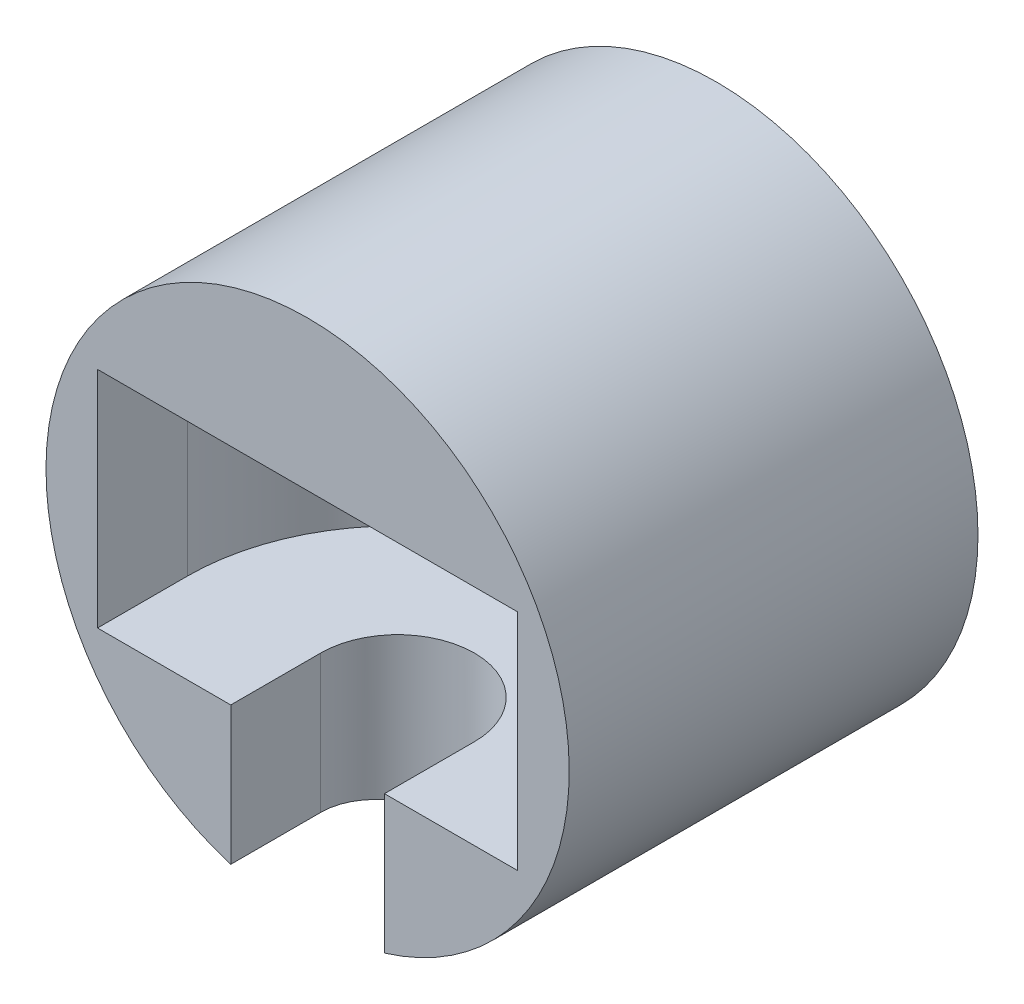
ISO-10303-21;
HEADER;
FILE_DESCRIPTION(('STEP AP214'),'2;1');
FILE_NAME('part.step','',(''),(''),'','','');
FILE_SCHEMA(('AUTOMOTIVE_DESIGN { 1 0 10303 214 1 1 1 1 }'));
ENDSEC;
DATA;
#1=APPLICATION_CONTEXT('core data for automotive mechanical design processes');
#2=APPLICATION_PROTOCOL_DEFINITION('international standard','automotive_design',2000,#1);
#3=PRODUCT_CONTEXT('',#1,'mechanical');
#4=PRODUCT('Part','Part','',(#3));
#5=PRODUCT_RELATED_PRODUCT_CATEGORY('part','',(#4));
#6=PRODUCT_DEFINITION_FORMATION('','',#4);
#7=PRODUCT_DEFINITION_CONTEXT('part definition',#1,'design');
#8=PRODUCT_DEFINITION('design','',#6,#7);
#9=PRODUCT_DEFINITION_SHAPE('','',#8);
#10=(LENGTH_UNIT() NAMED_UNIT(*) SI_UNIT(.MILLI.,.METRE.));
#11=(NAMED_UNIT(*) PLANE_ANGLE_UNIT() SI_UNIT($,.RADIAN.));
#12=(NAMED_UNIT(*) SI_UNIT($,.STERADIAN.) SOLID_ANGLE_UNIT());
#13=UNCERTAINTY_MEASURE_WITH_UNIT(LENGTH_MEASURE(1.E-05),#10,'distance_accuracy_value','');
#14=(GEOMETRIC_REPRESENTATION_CONTEXT(3) GLOBAL_UNCERTAINTY_ASSIGNED_CONTEXT((#13)) GLOBAL_UNIT_ASSIGNED_CONTEXT((#10,
#11,#12)) REPRESENTATION_CONTEXT('',''));
#15=CARTESIAN_POINT('',(0.,0.,0.));
#16=DIRECTION('',(0.,0.,1.));
#17=DIRECTION('',(1.,0.,0.));
#18=AXIS2_PLACEMENT_3D('',#15,#16,#17);
#19=CARTESIAN_POINT('',(0.,0.,25.));
#20=DIRECTION('',(0.,0.,1.));
#21=DIRECTION('',(1.,0.,0.));
#22=AXIS2_PLACEMENT_3D('',#19,#20,#21);
#23=PLANE('',#22);
#24=DIRECTION('',(0.,1.,0.));
#25=VECTOR('',#24,1.);
#26=CARTESIAN_POINT('',(4.7,-16.001,25.));
#27=LINE('',#26,#25);
#28=CARTESIAN_POINT('',(4.7,-15.2941165158371,25.));
#29=VERTEX_POINT('',#28);
#30=CARTESIAN_POINT('',(4.7,-6.85,25.));
#31=VERTEX_POINT('',#30);
#32=EDGE_CURVE('E116',#29,#31,#27,.T.);
#33=ORIENTED_EDGE('',*,*,#32,.F.);
#34=CARTESIAN_POINT('',(0.,0.,25.));
#35=DIRECTION('',(0.,0.,1.));
#36=DIRECTION('',(1.,0.,0.));
#37=AXIS2_PLACEMENT_3D('',#34,#35,#36);
#38=CIRCLE('',#37,16.);
#39=CARTESIAN_POINT('',(-4.7,-15.2941165158371,25.));
#40=VERTEX_POINT('',#39);
#41=EDGE_CURVE('E122',#29,#40,#38,.T.);
#42=ORIENTED_EDGE('',*,*,#41,.T.);
#43=DIRECTION('',(0.,1.,0.));
#44=VECTOR('',#43,1.);
#45=CARTESIAN_POINT('',(-4.7,-16.001,25.));
#46=LINE('',#45,#44);
#47=CARTESIAN_POINT('',(-4.7,-6.85,25.));
#48=VERTEX_POINT('',#47);
#49=EDGE_CURVE('E103',#40,#48,#46,.T.);
#50=ORIENTED_EDGE('',*,*,#49,.T.);
#51=DIRECTION('',(1.,0.,0.));
#52=VECTOR('',#51,1.);
#53=CARTESIAN_POINT('',(-12.85,-6.85,25.));
#54=LINE('',#53,#52);
#55=CARTESIAN_POINT('',(-12.85,-6.85,25.));
#56=VERTEX_POINT('',#55);
#57=EDGE_CURVE('E204',#56,#48,#54,.T.);
#58=ORIENTED_EDGE('',*,*,#57,.F.);
#59=DIRECTION('',(0.,1.,0.));
#60=VECTOR('',#59,1.);
#61=CARTESIAN_POINT('',(-12.85,-6.85,25.));
#62=LINE('',#61,#60);
#63=CARTESIAN_POINT('',(-12.85,6.85,25.));
#64=VERTEX_POINT('',#63);
#65=EDGE_CURVE('E230',#56,#64,#62,.T.);
#66=ORIENTED_EDGE('',*,*,#65,.T.);
#67=DIRECTION('',(1.,0.,0.));
#68=VECTOR('',#67,1.);
#69=CARTESIAN_POINT('',(-12.85,6.85,25.));
#70=LINE('',#69,#68);
#71=CARTESIAN_POINT('',(12.85,6.85,25.));
#72=VERTEX_POINT('',#71);
#73=EDGE_CURVE('E219',#64,#72,#70,.T.);
#74=ORIENTED_EDGE('',*,*,#73,.T.);
#75=DIRECTION('',(0.,1.,0.));
#76=VECTOR('',#75,1.);
#77=CARTESIAN_POINT('',(12.85,-6.85,25.));
#78=LINE('',#77,#76);
#79=CARTESIAN_POINT('',(12.85,-6.85,25.));
#80=VERTEX_POINT('',#79);
#81=EDGE_CURVE('E227',#80,#72,#78,.T.);
#82=ORIENTED_EDGE('',*,*,#81,.F.);
#83=EDGE_CURVE('E203',#31,#80,#54,.T.);
#84=ORIENTED_EDGE('',*,*,#83,.F.);
#85=EDGE_LOOP('',(#33,#42,#50,#58,#66,#74,#82,#84));
#86=FACE_BOUND('',#85,.T.);
#87=ADVANCED_FACE('F39',(#86),#23,.T.);
#88=CARTESIAN_POINT('',(0.,0.,0.));
#89=DIRECTION('',(0.,0.,1.));
#90=DIRECTION('',(1.,0.,0.));
#91=AXIS2_PLACEMENT_3D('',#88,#89,#90);
#92=PLANE('',#91);
#93=CARTESIAN_POINT('',(0.,0.,0.));
#94=DIRECTION('',(0.,0.,1.));
#95=DIRECTION('',(1.,0.,0.));
#96=AXIS2_PLACEMENT_3D('',#93,#94,#95);
#97=CIRCLE('',#96,16.);
#98=CARTESIAN_POINT('',(16.,0.,0.));
#99=VERTEX_POINT('',#98);
#100=EDGE_CURVE('E131',#99,#99,#97,.T.);
#101=ORIENTED_EDGE('',*,*,#100,.F.);
#102=EDGE_LOOP('',(#101));
#103=FACE_BOUND('',#102,.T.);
#104=CARTESIAN_POINT('',(0.,0.,0.));
#105=DIRECTION('',(0.,0.,1.));
#106=DIRECTION('',(1.,0.,0.));
#107=AXIS2_PLACEMENT_3D('',#104,#105,#106);
#108=CIRCLE('',#107,3.);
#109=CARTESIAN_POINT('',(3.,0.,0.));
#110=VERTEX_POINT('',#109);
#111=EDGE_CURVE('E137',#110,#110,#108,.T.);
#112=ORIENTED_EDGE('',*,*,#111,.T.);
#113=EDGE_LOOP('',(#112));
#114=FACE_BOUND('',#113,.T.);
#115=ADVANCED_FACE('F253',(#103,#114),#92,.F.);
#116=CARTESIAN_POINT('',(0.,0.,25.));
#117=DIRECTION('',(0.,0.,-1.));
#118=DIRECTION('',(-1.,0.,0.));
#119=AXIS2_PLACEMENT_3D('',#116,#117,#118);
#120=CYLINDRICAL_SURFACE('',#119,16.);
#121=ORIENTED_EDGE('',*,*,#41,.F.);
#122=DIRECTION('',(0.,0.,-1.));
#123=VECTOR('',#122,1.);
#124=CARTESIAN_POINT('',(4.7,-15.2941165158371,25.));
#125=LINE('',#124,#123);
#126=CARTESIAN_POINT('',(4.7,-15.2941165158371,19.5));
#127=VERTEX_POINT('',#126);
#128=EDGE_CURVE('E126',#127,#29,#125,.F.);
#129=ORIENTED_EDGE('',*,*,#128,.F.);
#130=CARTESIAN_POINT('',(-4.7,-15.2941165158371,19.5));
#131=CARTESIAN_POINT('',(-4.70001722579124,-15.2940984911914,19.3708763082752));
#132=CARTESIAN_POINT('',(-4.69467959532677,-15.2957511508983,19.2417593694433));
#133=CARTESIAN_POINT('',(-4.67342256857162,-15.3022661358053,18.984508204904));
#134=CARTESIAN_POINT('',(-4.65750546907339,-15.3071277643399,18.8563737720018));
#135=CARTESIAN_POINT('',(-4.61526925327359,-15.3199133773802,18.602312180988));
#136=CARTESIAN_POINT('',(-4.58897576774615,-15.3278298151223,18.4763803766041));
#137=CARTESIAN_POINT('',(-4.5262242254477,-15.3464774972835,18.2272901426551));
#138=CARTESIAN_POINT('',(-4.48976592026478,-15.3572088104933,18.1041317809481));
#139=CARTESIAN_POINT('',(-4.4070055073212,-15.3811622942011,17.8614888464773));
#140=CARTESIAN_POINT('',(-4.36070883811933,-15.3943830880787,17.7420022855742));
#141=CARTESIAN_POINT('',(-4.25862992247319,-15.4229334616981,17.5073978493071));
#142=CARTESIAN_POINT('',(-4.20284414826205,-15.4382638253089,17.3922816182415));
#143=CARTESIAN_POINT('',(-4.0218311511316,-15.4867850041534,17.0545989340589));
#144=CARTESIAN_POINT('',(-3.88289744008188,-15.5225213483323,16.8395503315135));
#145=CARTESIAN_POINT('',(-3.56816800393936,-15.5979162855502,16.4296838288117));
#146=CARTESIAN_POINT('',(-3.39146957040254,-15.6376553167489,16.2355784145308));
#147=CARTESIAN_POINT('',(-3.00808711855809,-15.7159038781299,15.8792437246022));
#148=CARTESIAN_POINT('',(-2.80139808669533,-15.754413201425,15.7170197893066));
#149=CARTESIAN_POINT('',(-2.35887540797605,-15.8267773011811,15.4260339930174));
#150=CARTESIAN_POINT('',(-2.12254676966987,-15.8605251272551,15.2979962986612));
#151=CARTESIAN_POINT('',(-1.63056291961247,-15.9186216161317,15.0837574944262));
#152=CARTESIAN_POINT('',(-1.37491254914412,-15.9429726241401,14.9975459444265));
#153=CARTESIAN_POINT('',(-0.858992820259392,-15.9789590165522,14.8717519184727));
#154=CARTESIAN_POINT('',(-0.599043601139717,-15.9909255320816,14.8309528304415));
#155=CARTESIAN_POINT('',(-0.0757272893159784,-16.0019593685531,14.7932973725569));
#156=CARTESIAN_POINT('',(0.187639177046515,-16.0010290208842,14.7964330605367));
#157=CARTESIAN_POINT('',(0.701781987076624,-15.986609052891,14.8457363968185));
#158=CARTESIAN_POINT('',(0.95269714902101,-15.9735040204677,14.8905863762989));
#159=CARTESIAN_POINT('',(1.44326434772073,-15.936672546209,15.0198939164618));
#160=CARTESIAN_POINT('',(1.68291580259773,-15.9129455563127,15.1043535208919));
#161=CARTESIAN_POINT('',(2.14734195764715,-15.8569951667603,15.3114089637335));
#162=CARTESIAN_POINT('',(2.3719168890139,-15.8246783717435,15.4344268485726));
#163=CARTESIAN_POINT('',(2.79764060073814,-15.7549934982056,15.7147339994));
#164=CARTESIAN_POINT('',(2.99878433364763,-15.7176243350571,15.8720306286955));
#165=CARTESIAN_POINT('',(3.37988171524785,-15.6401924120016,16.2234273838237));
#166=CARTESIAN_POINT('',(3.5587785947666,-15.6000811423672,16.4186720640302));
#167=CARTESIAN_POINT('',(3.8007739519457,-15.5422339151979,16.73203561699));
#168=CARTESIAN_POINT('',(3.87709053299929,-15.523325993261,16.8399870129123));
#169=CARTESIAN_POINT('',(4.02044411990821,-15.4868166445026,17.0620774806235));
#170=CARTESIAN_POINT('',(4.08748474023834,-15.4692147100364,17.1762141180049));
#171=CARTESIAN_POINT('',(4.21240211941698,-15.435669671594,17.4110905645856));
#172=CARTESIAN_POINT('',(4.2701822732532,-15.4197445836125,17.5318842732742));
#173=CARTESIAN_POINT('',(4.37529241280977,-15.3902500196851,17.7781607867937));
#174=CARTESIAN_POINT('',(4.42262665920373,-15.376679583809,17.9036416553175));
#175=CARTESIAN_POINT('',(4.50641708325567,-15.3523324055034,18.158301526974));
#176=CARTESIAN_POINT('',(4.54288467377239,-15.3415527336072,18.2874764928894));
#177=CARTESIAN_POINT('',(4.60466012124381,-15.3231244085038,18.5486325143976));
#178=CARTESIAN_POINT('',(4.62997313556819,-15.3154743084421,18.6806122435452));
#179=CARTESIAN_POINT('',(4.66636734396714,-15.3044221302613,18.9271110694695));
#180=CARTESIAN_POINT('',(4.67898025459734,-15.3005648413854,19.0413861511911));
#181=CARTESIAN_POINT('',(4.69579514378743,-15.2954085279916,19.2704378623983));
#182=CARTESIAN_POINT('',(4.70000970338144,-15.2941056768805,19.3852134831475));
#183=CARTESIAN_POINT('',(4.7,-15.2941165158371,19.5));
#184=B_SPLINE_CURVE_WITH_KNOTS('',3,(#130,#131,#132,#133,#134,#135,#136,#137,#138,#139,#140,
#141,#142,#143,#144,#145,#146,#147,#148,#149,#150,#151,#152,#153,#154,#155,#156,#157,#158,#159,
#160,#161,#162,#163,#164,#165,#166,#167,#168,#169,#170,#171,#172,#173,#174,#175,#176,#177,#178,
#179,#180,#181,#182,#183),.UNSPECIFIED.,.F.,.F.,(4,2,2,2,2,2,2,2,2,2,2,2,2,2,2,2,2,2,2,2,2,2,2,
2,2,2,4),(0.,0.387239730218642,0.77439541851616,1.1606007175409,1.54681545563184,
1.93281725049951,2.31896286425264,3.09078761057912,3.88368109944087,4.67670729005339,
5.48539601040462,6.29388277197121,7.08014560456739,7.86626630488029,8.62836891009986,
9.39051084204202,10.1613047782044,10.9322644496304,11.7316934059132,12.1319552872169,
12.532060760407,12.9361010335717,13.3399762010621,13.743425685675,14.1466884373397,
14.4914600193035,14.8357147315061),.UNSPECIFIED.);
#185=CARTESIAN_POINT('',(-4.7,-15.2941165158371,19.5));
#186=VERTEX_POINT('',#185);
#187=EDGE_CURVE('E115',#186,#127,#184,.T.);
#188=ORIENTED_EDGE('',*,*,#187,.F.);
#189=DIRECTION('',(0.,0.,-1.));
#190=VECTOR('',#189,1.);
#191=CARTESIAN_POINT('',(-4.7,-15.2941165158371,25.));
#192=LINE('',#191,#190);
#193=EDGE_CURVE('E106',#40,#186,#192,.T.);
#194=ORIENTED_EDGE('',*,*,#193,.F.);
#195=EDGE_LOOP('',(#121,#129,#188,#194));
#196=FACE_BOUND('',#195,.T.);
#197=ORIENTED_EDGE('',*,*,#100,.T.);
#198=EDGE_LOOP('',(#197));
#199=FACE_BOUND('',#198,.T.);
#200=ADVANCED_FACE('F41',(#196,#199),#120,.T.);
#201=CARTESIAN_POINT('',(0.,0.,25.));
#202=DIRECTION('',(0.,0.,-1.));
#203=DIRECTION('',(-1.,0.,0.));
#204=AXIS2_PLACEMENT_3D('',#201,#202,#203);
#205=CYLINDRICAL_SURFACE('',#204,3.);
#206=CARTESIAN_POINT('',(-3.,0.,7.0051010408247));
#207=CARTESIAN_POINT('',(-2.99999470907691,0.166028512764044,7.0050977226662));
#208=CARTESIAN_POINT('',(-2.9861703506378,0.332118224622122,7.00175574512387));
#209=CARTESIAN_POINT('',(-2.93131117312189,0.659553322120775,6.98877779958548));
#210=CARTESIAN_POINT('',(-2.89025844150378,0.820895511520657,6.97913768834235));
#211=CARTESIAN_POINT('',(-2.78232300132453,1.13405201120201,6.95471342855461));
#212=CARTESIAN_POINT('',(-2.71547090047065,1.28587736483668,6.93993537758043));
#213=CARTESIAN_POINT('',(-2.55792474284669,1.5761670773805,6.906907794844));
#214=CARTESIAN_POINT('',(-2.46723048288505,1.71463132240767,6.88865823349665));
#215=CARTESIAN_POINT('',(-2.26271491067282,1.97692995008076,6.85035170744761));
#216=CARTESIAN_POINT('',(-2.14852080056412,2.10046994694851,6.83026894577286));
#217=CARTESIAN_POINT('',(-1.90105108475457,2.32682804913734,6.79078372480862));
#218=CARTESIAN_POINT('',(-1.76777386541687,2.4296444003285,6.77138132322218));
#219=CARTESIAN_POINT('',(-1.48392764218938,2.61281940607468,6.7351599183713));
#220=CARTESIAN_POINT('',(-1.33316940928446,2.69289213499781,6.7183749089768));
#221=CARTESIAN_POINT('',(-1.01987763299555,2.82645290036293,6.68957223017544));
#222=CARTESIAN_POINT('',(-0.857345602105575,2.87994434459418,6.67755394970155));
#223=CARTESIAN_POINT('',(-0.528184800652949,2.9578904169478,6.65982119277503));
#224=CARTESIAN_POINT('',(-0.361680133170343,2.9828440853866,6.65399850419767));
#225=CARTESIAN_POINT('',(-0.0267528819257883,3.00456936239959,6.64893707597122));
#226=CARTESIAN_POINT('',(0.141669450361024,3.00134462462409,6.64969748274894));
#227=CARTESIAN_POINT('',(0.472201427490859,2.96717050157748,6.65763484342673));
#228=CARTESIAN_POINT('',(0.634370157551069,2.93675935285471,6.66468722345705));
#229=CARTESIAN_POINT('',(0.951236413489698,2.84993675134363,6.68427280139516));
#230=CARTESIAN_POINT('',(1.1059335719623,2.79352402139311,6.69680626852491));
#231=CARTESIAN_POINT('',(1.40492475337524,2.65584220821386,6.72614166673384));
#232=CARTESIAN_POINT('',(1.54912400270651,2.5743748250684,6.74297746291281));
#233=CARTESIAN_POINT('',(1.82199766775204,2.38904523429732,6.77908033805682));
#234=CARTESIAN_POINT('',(1.95066969257344,2.28517958461603,6.7983477905179));
#235=CARTESIAN_POINT('',(2.19204216206519,2.0550915478133,6.83774186778517));
#236=CARTESIAN_POINT('',(2.30429265012156,1.92839831298789,6.85787803468096));
#237=CARTESIAN_POINT('',(2.50604586720338,1.65777560202987,6.89631749484081));
#238=CARTESIAN_POINT('',(2.59554779270593,1.51384551732275,6.91462072334813));
#239=CARTESIAN_POINT('',(2.74950260932628,1.21203719368933,6.94735157926365));
#240=CARTESIAN_POINT('',(2.81385994701871,1.05410849265619,6.96176435946618));
#241=CARTESIAN_POINT('',(2.91497945529914,0.729258857873723,6.98488458381211));
#242=CARTESIAN_POINT('',(2.95174668689482,0.562339579340169,6.99359307428806));
#243=CARTESIAN_POINT('',(2.99592240606394,0.228386530757243,7.004102383629));
#244=CARTESIAN_POINT('',(3.00399066673767,0.0614448166728867,7.00605840628464));
#245=CARTESIAN_POINT('',(2.99233482465829,-0.27139862561757,7.00326171898362));
#246=CARTESIAN_POINT('',(2.97261292178243,-0.437300435098627,6.99850954005005));
#247=CARTESIAN_POINT('',(2.90651188483389,-0.760988587354422,6.98297946596038));
#248=CARTESIAN_POINT('',(2.86050550795912,-0.918855476057042,6.97228588681592));
#249=CARTESIAN_POINT('',(2.74354945066474,-1.2246388725026,6.94615578739338));
#250=CARTESIAN_POINT('',(2.67259711634352,-1.37255431955563,6.93071876250092));
#251=CARTESIAN_POINT('',(2.50634295182768,-1.65706411090716,6.89650663930423));
#252=CARTESIAN_POINT('',(2.4106401358128,-1.79341759816103,6.87767828764235));
#253=CARTESIAN_POINT('',(2.19811820868278,-2.04837189686989,6.83894087588271));
#254=CARTESIAN_POINT('',(2.08129609070387,-2.16697017602323,6.81903166217984));
#255=CARTESIAN_POINT('',(1.82684659319313,-2.385659089224,6.77985759685747));
#256=CARTESIAN_POINT('',(1.68882581529335,-2.48529685779346,6.76061581025968));
#257=CARTESIAN_POINT('',(1.39762468512821,-2.65997507952997,6.7253914932114));
#258=CARTESIAN_POINT('',(1.24444508733414,-2.73501675607102,6.70940880067325));
#259=CARTESIAN_POINT('',(0.928287253424025,-2.85776748988647,6.68259956178073));
#260=CARTESIAN_POINT('',(0.765384125427537,-2.90566202111116,6.67173811419311));
#261=CARTESIAN_POINT('',(0.433558480162693,-2.97332910255011,6.65624333173442));
#262=CARTESIAN_POINT('',(0.26463697204927,-2.9931063449014,6.65160895771326));
#263=CARTESIAN_POINT('',(-0.0701522562818204,-3.0037421163149,6.6491266330523));
#264=CARTESIAN_POINT('',(-0.235997791780655,-2.99527308683819,6.6511208751742));
#265=CARTESIAN_POINT('',(-0.56383234553105,-2.95117726202601,6.66132821485638));
#266=CARTESIAN_POINT('',(-0.725821452664713,-2.91555109322835,6.66954116894576));
#267=CARTESIAN_POINT('',(-1.04074045967071,-2.81849280479648,6.69124551943138));
#268=CARTESIAN_POINT('',(-1.19370508786243,-2.75716813116513,6.70471492256616));
#269=CARTESIAN_POINT('',(-1.48725700699566,-2.61055412764395,6.73550334404514));
#270=CARTESIAN_POINT('',(-1.62784292164269,-2.52526213741901,6.75282278969351));
#271=CARTESIAN_POINT('',(-1.89588616581903,-2.33100654125102,6.78989254769476));
#272=CARTESIAN_POINT('',(-2.02300009474002,-2.22157744769058,6.80968677801784));
#273=CARTESIAN_POINT('',(-2.25728968118433,-1.9830770489688,6.84925721693834));
#274=CARTESIAN_POINT('',(-2.36446042569151,-1.85400091794715,6.86903341990384));
#275=CARTESIAN_POINT('',(-2.55745867062371,-1.57743017517992,6.9066783723353));
#276=CARTESIAN_POINT('',(-2.64292447029726,-1.42967809572537,6.92451228015908));
#277=CARTESIAN_POINT('',(-2.78767529883211,-1.1215149993868,6.95580248937792));
#278=CARTESIAN_POINT('',(-2.84698109481455,-0.961114143416836,6.96926226093849));
#279=CARTESIAN_POINT('',(-2.92793187163041,-0.667283901861408,6.98796452567447));
#280=CARTESIAN_POINT('',(-2.95490246496243,-0.535368551470736,6.99434554134607));
#281=CARTESIAN_POINT('',(-2.99093810295283,-0.268982081797949,7.00291500971609));
#282=CARTESIAN_POINT('',(-3.00000428654096,-0.134511125631671,7.00510372909329));
#283=CARTESIAN_POINT('',(-3.,0.,7.0051010408247));
#284=B_SPLINE_CURVE_WITH_KNOTS('',3,(#206,#207,#208,#209,#210,#211,#212,#213,#214,#215,#216,
#217,#218,#219,#220,#221,#222,#223,#224,#225,#226,#227,#228,#229,#230,#231,#232,#233,#234,#235,
#236,#237,#238,#239,#240,#241,#242,#243,#244,#245,#246,#247,#248,#249,#250,#251,#252,#253,#254,
#255,#256,#257,#258,#259,#260,#261,#262,#263,#264,#265,#266,#267,#268,#269,#270,#271,#272,#273,
#274,#275,#276,#277,#278,#279,#280,#281,#282,#283),.UNSPECIFIED.,.T.,.F.,(4,2,2,2,2,2,2,2,2,2,2,
2,2,2,2,2,2,2,2,2,2,2,2,2,2,2,2,2,2,2,2,2,2,2,2,2,2,2,4),(0.,0.497592131049229,
0.995511934706267,1.49284282614585,1.99017795615789,2.49611309620999,3.0020910426117,
3.51417375778937,4.02619080569376,4.52911030611778,5.03196459828575,5.52507859893712,
6.01821682325755,6.51536315866875,7.01258594760218,7.52157390661285,8.0305798415576,
8.5415016911446,9.05232979654984,9.5513355086411,10.0503017215173,10.5423614445903,
11.0344735317964,11.5351210728157,12.0358399498204,12.547327019869,13.0587886454294,
13.5667124017705,14.0745513872175,14.5703876798781,15.0662125335287,15.5599846960667,
16.053811688216,16.5581566611505,17.0626257157822,17.5750189219081,18.0870046293624,
18.4901639095587,18.8932975432859),.UNSPECIFIED.);
#285=CARTESIAN_POINT('',(-3.,0.,7.0051010408247));
#286=VERTEX_POINT('',#285);
#287=EDGE_CURVE('E142',#286,#286,#284,.T.);
#288=ORIENTED_EDGE('',*,*,#287,.F.);
#289=EDGE_LOOP('',(#288));
#290=FACE_BOUND('',#289,.T.);
#291=ORIENTED_EDGE('',*,*,#111,.F.);
#292=EDGE_LOOP('',(#291));
#293=FACE_BOUND('',#292,.T.);
#294=ADVANCED_FACE('F151',(#290,#293),#205,.F.);
#295=CARTESIAN_POINT('',(0.,-6.85,19.5));
#296=DIRECTION('',(0.,1.,0.));
#297=DIRECTION('',(0.,0.,1.));
#298=AXIS2_PLACEMENT_3D('',#295,#296,#297);
#299=CYLINDRICAL_SURFACE('',#298,12.85);
#300=ORIENTED_EDGE('',*,*,#287,.T.);
#301=EDGE_LOOP('',(#300));
#302=FACE_BOUND('',#301,.T.);
#303=CARTESIAN_POINT('',(0.,6.85,19.5));
#304=DIRECTION('',(0.,1.,0.));
#305=DIRECTION('',(0.,0.,1.));
#306=AXIS2_PLACEMENT_3D('',#303,#304,#305);
#307=CIRCLE('',#306,12.85);
#308=CARTESIAN_POINT('',(12.85,6.85,19.5));
#309=VERTEX_POINT('',#308);
#310=CARTESIAN_POINT('',(-12.85,6.85,19.5));
#311=VERTEX_POINT('',#310);
#312=EDGE_CURVE('E125',#309,#311,#307,.T.);
#313=ORIENTED_EDGE('',*,*,#312,.T.);
#314=DIRECTION('',(0.,1.,0.));
#315=VECTOR('',#314,1.);
#316=CARTESIAN_POINT('',(-12.85,-6.85,19.5));
#317=LINE('',#316,#315);
#318=CARTESIAN_POINT('',(-12.85,-6.85,19.5));
#319=VERTEX_POINT('',#318);
#320=EDGE_CURVE('E211',#319,#311,#317,.T.);
#321=ORIENTED_EDGE('',*,*,#320,.F.);
#322=CARTESIAN_POINT('',(0.,-6.85,19.5));
#323=DIRECTION('',(0.,1.,0.));
#324=DIRECTION('',(0.,0.,1.));
#325=AXIS2_PLACEMENT_3D('',#322,#323,#324);
#326=CIRCLE('',#325,12.85);
#327=CARTESIAN_POINT('',(12.85,-6.85,19.5));
#328=VERTEX_POINT('',#327);
#329=EDGE_CURVE('E195',#328,#319,#326,.T.);
#330=ORIENTED_EDGE('',*,*,#329,.F.);
#331=DIRECTION('',(0.,1.,0.));
#332=VECTOR('',#331,1.);
#333=CARTESIAN_POINT('',(12.85,-6.85,19.5));
#334=LINE('',#333,#332);
#335=EDGE_CURVE('E150',#328,#309,#334,.T.);
#336=ORIENTED_EDGE('',*,*,#335,.T.);
#337=EDGE_LOOP('',(#313,#321,#330,#336));
#338=FACE_BOUND('',#337,.T.);
#339=ADVANCED_FACE('F154',(#302,#338),#299,.F.);
#340=CARTESIAN_POINT('',(12.85,-6.85,25.));
#341=DIRECTION('',(1.,0.,0.));
#342=DIRECTION('',(0.,0.,-1.));
#343=AXIS2_PLACEMENT_3D('',#340,#341,#342);
#344=PLANE('',#343);
#345=DIRECTION('',(0.,0.,-1.));
#346=VECTOR('',#345,1.);
#347=CARTESIAN_POINT('',(12.85,6.85,25.));
#348=LINE('',#347,#346);
#349=EDGE_CURVE('E63',#72,#309,#348,.T.);
#350=ORIENTED_EDGE('',*,*,#349,.T.);
#351=ORIENTED_EDGE('',*,*,#335,.F.);
#352=DIRECTION('',(0.,0.,-1.));
#353=VECTOR('',#352,1.);
#354=CARTESIAN_POINT('',(12.85,-6.85,25.));
#355=LINE('',#354,#353);
#356=EDGE_CURVE('E207',#80,#328,#355,.T.);
#357=ORIENTED_EDGE('',*,*,#356,.F.);
#358=ORIENTED_EDGE('',*,*,#81,.T.);
#359=EDGE_LOOP('',(#350,#351,#357,#358));
#360=FACE_BOUND('',#359,.T.);
#361=ADVANCED_FACE('F158',(#360),#344,.F.);
#362=CARTESIAN_POINT('',(-12.85,-6.85,25.));
#363=DIRECTION('',(-1.,0.,0.));
#364=DIRECTION('',(0.,0.,1.));
#365=AXIS2_PLACEMENT_3D('',#362,#363,#364);
#366=PLANE('',#365);
#367=DIRECTION('',(0.,0.,1.));
#368=VECTOR('',#367,1.);
#369=CARTESIAN_POINT('',(-12.85,6.85,25.));
#370=LINE('',#369,#368);
#371=EDGE_CURVE('E215',#311,#64,#370,.T.);
#372=ORIENTED_EDGE('',*,*,#371,.T.);
#373=ORIENTED_EDGE('',*,*,#65,.F.);
#374=DIRECTION('',(0.,0.,1.));
#375=VECTOR('',#374,1.);
#376=CARTESIAN_POINT('',(-12.85,-6.85,25.));
#377=LINE('',#376,#375);
#378=EDGE_CURVE('E199',#319,#56,#377,.T.);
#379=ORIENTED_EDGE('',*,*,#378,.F.);
#380=ORIENTED_EDGE('',*,*,#320,.T.);
#381=EDGE_LOOP('',(#372,#373,#379,#380));
#382=FACE_BOUND('',#381,.T.);
#383=ADVANCED_FACE('F160',(#382),#366,.F.);
#384=CARTESIAN_POINT('',(0.,-6.85,19.5));
#385=DIRECTION('',(0.,1.,0.));
#386=DIRECTION('',(0.,0.,1.));
#387=AXIS2_PLACEMENT_3D('',#384,#385,#386);
#388=PLANE('',#387);
#389=DIRECTION('',(0.,0.,-1.));
#390=VECTOR('',#389,1.);
#391=CARTESIAN_POINT('',(4.7,-6.85,19.5));
#392=LINE('',#391,#390);
#393=CARTESIAN_POINT('',(4.7,-6.85,19.5));
#394=VERTEX_POINT('',#393);
#395=EDGE_CURVE('E11',#31,#394,#392,.T.);
#396=ORIENTED_EDGE('',*,*,#395,.F.);
#397=ORIENTED_EDGE('',*,*,#83,.T.);
#398=ORIENTED_EDGE('',*,*,#356,.T.);
#399=ORIENTED_EDGE('',*,*,#329,.T.);
#400=ORIENTED_EDGE('',*,*,#378,.T.);
#401=ORIENTED_EDGE('',*,*,#57,.T.);
#402=DIRECTION('',(0.,0.,1.));
#403=VECTOR('',#402,1.);
#404=CARTESIAN_POINT('',(-4.7,-6.85,19.5));
#405=LINE('',#404,#403);
#406=CARTESIAN_POINT('',(-4.7,-6.85,19.5));
#407=VERTEX_POINT('',#406);
#408=EDGE_CURVE('E109',#407,#48,#405,.T.);
#409=ORIENTED_EDGE('',*,*,#408,.F.);
#410=CARTESIAN_POINT('',(0.,-6.85,19.5));
#411=DIRECTION('',(0.,1.,0.));
#412=DIRECTION('',(0.,0.,1.));
#413=AXIS2_PLACEMENT_3D('',#410,#411,#412);
#414=CIRCLE('',#413,4.7);
#415=EDGE_CURVE('E48',#394,#407,#414,.T.);
#416=ORIENTED_EDGE('',*,*,#415,.F.);
#417=EDGE_LOOP('',(#396,#397,#398,#399,#400,#401,#409,#416));
#418=FACE_BOUND('',#417,.T.);
#419=ADVANCED_FACE('F163',(#418),#388,.T.);
#420=CARTESIAN_POINT('',(0.,6.85,19.5));
#421=DIRECTION('',(0.,1.,0.));
#422=DIRECTION('',(0.,0.,1.));
#423=AXIS2_PLACEMENT_3D('',#420,#421,#422);
#424=PLANE('',#423);
#425=ORIENTED_EDGE('',*,*,#312,.F.);
#426=ORIENTED_EDGE('',*,*,#349,.F.);
#427=ORIENTED_EDGE('',*,*,#73,.F.);
#428=ORIENTED_EDGE('',*,*,#371,.F.);
#429=EDGE_LOOP('',(#425,#426,#427,#428));
#430=FACE_BOUND('',#429,.T.);
#431=ADVANCED_FACE('F168',(#430),#424,.F.);
#432=CARTESIAN_POINT('',(0.,-16.001,19.5));
#433=DIRECTION('',(0.,1.,0.));
#434=DIRECTION('',(0.,0.,1.));
#435=AXIS2_PLACEMENT_3D('',#432,#433,#434);
#436=CYLINDRICAL_SURFACE('',#435,4.7);
#437=ORIENTED_EDGE('',*,*,#415,.T.);
#438=DIRECTION('',(0.,1.,0.));
#439=VECTOR('',#438,1.);
#440=CARTESIAN_POINT('',(-4.7,-16.001,19.5));
#441=LINE('',#440,#439);
#442=EDGE_CURVE('E55',#186,#407,#441,.T.);
#443=ORIENTED_EDGE('',*,*,#442,.F.);
#444=ORIENTED_EDGE('',*,*,#187,.T.);
#445=DIRECTION('',(0.,1.,0.));
#446=VECTOR('',#445,1.);
#447=CARTESIAN_POINT('',(4.7,-16.001,19.5));
#448=LINE('',#447,#446);
#449=EDGE_CURVE('E187',#127,#394,#448,.T.);
#450=ORIENTED_EDGE('',*,*,#449,.T.);
#451=EDGE_LOOP('',(#437,#443,#444,#450));
#452=FACE_BOUND('',#451,.T.);
#453=ADVANCED_FACE('F171',(#452),#436,.F.);
#454=CARTESIAN_POINT('',(4.7,-16.001,19.5));
#455=DIRECTION('',(1.,0.,0.));
#456=DIRECTION('',(0.,0.,-1.));
#457=AXIS2_PLACEMENT_3D('',#454,#455,#456);
#458=PLANE('',#457);
#459=ORIENTED_EDGE('',*,*,#395,.T.);
#460=ORIENTED_EDGE('',*,*,#449,.F.);
#461=ORIENTED_EDGE('',*,*,#128,.T.);
#462=ORIENTED_EDGE('',*,*,#32,.T.);
#463=EDGE_LOOP('',(#459,#460,#461,#462));
#464=FACE_BOUND('',#463,.T.);
#465=ADVANCED_FACE('F245',(#464),#458,.F.);
#466=CARTESIAN_POINT('',(-4.7,-16.001,19.5));
#467=DIRECTION('',(-1.,0.,0.));
#468=DIRECTION('',(0.,0.,1.));
#469=AXIS2_PLACEMENT_3D('',#466,#467,#468);
#470=PLANE('',#469);
#471=ORIENTED_EDGE('',*,*,#408,.T.);
#472=ORIENTED_EDGE('',*,*,#49,.F.);
#473=ORIENTED_EDGE('',*,*,#193,.T.);
#474=ORIENTED_EDGE('',*,*,#442,.T.);
#475=EDGE_LOOP('',(#471,#472,#473,#474));
#476=FACE_BOUND('',#475,.T.);
#477=ADVANCED_FACE('F105',(#476),#470,.F.);
#478=CLOSED_SHELL('',(#87,#115,#200,#294,#339,#361,#383,#419,#431,#453,#465,#477));
#479=MANIFOLD_SOLID_BREP('B2',#478);
#480=ADVANCED_BREP_SHAPE_REPRESENTATION('',(#18,#479),#14);
#481=SHAPE_DEFINITION_REPRESENTATION(#9,#480);
ENDSEC;
END-ISO-10303-21;
